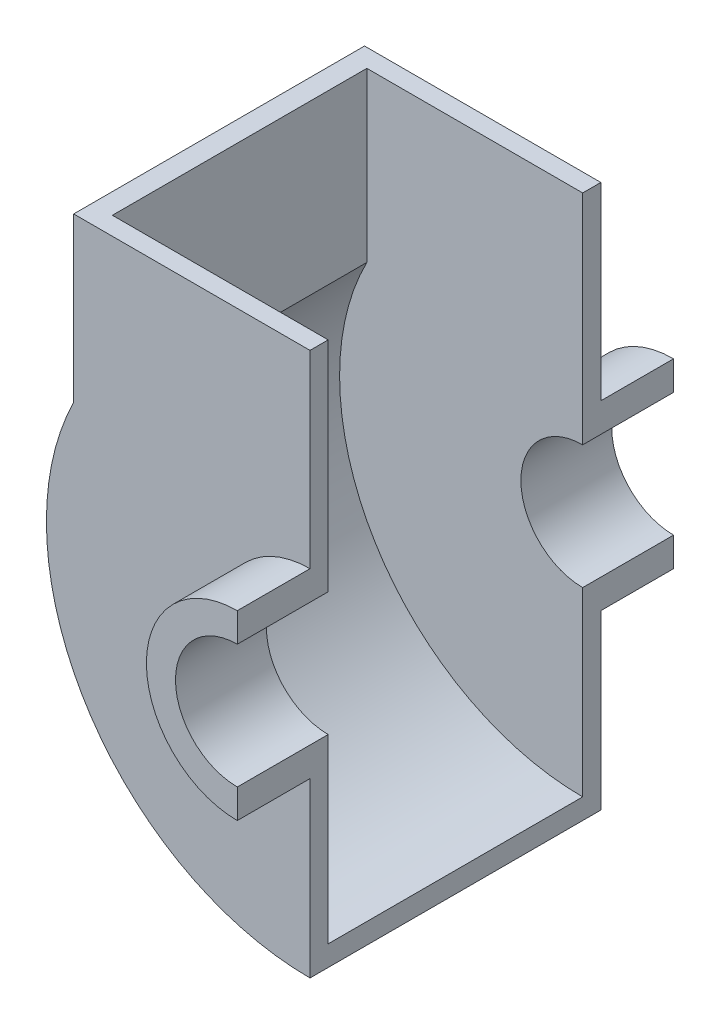
ISO-10303-21;
HEADER;
FILE_DESCRIPTION(('STEP AP214'),'2;1');
FILE_NAME('part.step','',(''),(''),'','','');
FILE_SCHEMA(('AUTOMOTIVE_DESIGN { 1 0 10303 214 1 1 1 1 }'));
ENDSEC;
DATA;
#1=APPLICATION_CONTEXT('core data for automotive mechanical design processes');
#2=APPLICATION_PROTOCOL_DEFINITION('international standard','automotive_design',2000,#1);
#3=PRODUCT_CONTEXT('',#1,'mechanical');
#4=PRODUCT('Part','Part','',(#3));
#5=PRODUCT_RELATED_PRODUCT_CATEGORY('part','',(#4));
#6=PRODUCT_DEFINITION_FORMATION('','',#4);
#7=PRODUCT_DEFINITION_CONTEXT('part definition',#1,'design');
#8=PRODUCT_DEFINITION('design','',#6,#7);
#9=PRODUCT_DEFINITION_SHAPE('','',#8);
#10=(LENGTH_UNIT() NAMED_UNIT(*) SI_UNIT(.MILLI.,.METRE.));
#11=(NAMED_UNIT(*) PLANE_ANGLE_UNIT() SI_UNIT($,.RADIAN.));
#12=(NAMED_UNIT(*) SI_UNIT($,.STERADIAN.) SOLID_ANGLE_UNIT());
#13=UNCERTAINTY_MEASURE_WITH_UNIT(LENGTH_MEASURE(1.E-05),#10,'distance_accuracy_value','');
#14=(GEOMETRIC_REPRESENTATION_CONTEXT(3) GLOBAL_UNCERTAINTY_ASSIGNED_CONTEXT((#13)) GLOBAL_UNIT_ASSIGNED_CONTEXT((#10,
#11,#12)) REPRESENTATION_CONTEXT('',''));
#15=CARTESIAN_POINT('',(0.,0.,0.));
#16=DIRECTION('',(0.,0.,1.));
#17=DIRECTION('',(1.,0.,0.));
#18=AXIS2_PLACEMENT_3D('',#15,#16,#17);
#19=CARTESIAN_POINT('',(0.,0.,-5.));
#20=DIRECTION('',(0.,0.,1.));
#21=DIRECTION('',(1.,0.,0.));
#22=AXIS2_PLACEMENT_3D('',#19,#20,#21);
#23=PLANE('',#22);
#24=CARTESIAN_POINT('',(0.,0.,-5.));
#25=DIRECTION('',(0.,0.,1.));
#26=DIRECTION('',(1.,0.,0.));
#27=AXIS2_PLACEMENT_3D('',#24,#25,#26);
#28=CIRCLE('',#27,66.86);
#29=CARTESIAN_POINT('',(-59.36,30.7676778454273,-5.));
#30=VERTEX_POINT('',#29);
#31=CARTESIAN_POINT('',(0.,-66.86,-5.));
#32=VERTEX_POINT('',#31);
#33=EDGE_CURVE('E204',#30,#32,#28,.T.);
#34=ORIENTED_EDGE('',*,*,#33,.F.);
#35=DIRECTION('',(0.,-1.,0.));
#36=VECTOR('',#35,1.);
#37=CARTESIAN_POINT('',(-59.36,77.,-5.));
#38=LINE('',#37,#36);
#39=CARTESIAN_POINT('',(-59.36,77.,-5.));
#40=VERTEX_POINT('',#39);
#41=EDGE_CURVE('E56',#40,#30,#38,.T.);
#42=ORIENTED_EDGE('',*,*,#41,.F.);
#43=DIRECTION('',(-1.,0.,0.));
#44=VECTOR('',#43,1.);
#45=CARTESIAN_POINT('',(0.,77.,-5.));
#46=LINE('',#45,#44);
#47=CARTESIAN_POINT('',(0.,77.,-5.));
#48=VERTEX_POINT('',#47);
#49=EDGE_CURVE('E211',#48,#40,#46,.T.);
#50=ORIENTED_EDGE('',*,*,#49,.F.);
#51=DIRECTION('',(0.,1.,0.));
#52=VECTOR('',#51,1.);
#53=CARTESIAN_POINT('',(0.,25.,-5.));
#54=LINE('',#53,#52);
#55=CARTESIAN_POINT('',(0.,17.,-5.));
#56=VERTEX_POINT('',#55);
#57=EDGE_CURVE('E254',#56,#48,#54,.T.);
#58=ORIENTED_EDGE('',*,*,#57,.F.);
#59=CARTESIAN_POINT('',(0.,0.,-5.));
#60=DIRECTION('',(0.,0.,-1.));
#61=DIRECTION('',(1.,0.,0.));
#62=AXIS2_PLACEMENT_3D('',#59,#60,#61);
#63=CIRCLE('',#62,17.);
#64=CARTESIAN_POINT('',(0.,-17.,-5.));
#65=VERTEX_POINT('',#64);
#66=EDGE_CURVE('E251',#65,#56,#63,.T.);
#67=ORIENTED_EDGE('',*,*,#66,.F.);
#68=DIRECTION('',(0.,1.,0.));
#69=VECTOR('',#68,1.);
#70=CARTESIAN_POINT('',(0.,-17.,-5.));
#71=LINE('',#70,#69);
#72=EDGE_CURVE('E62',#32,#65,#71,.T.);
#73=ORIENTED_EDGE('',*,*,#72,.F.);
#74=EDGE_LOOP('',(#34,#42,#50,#58,#67,#73));
#75=FACE_BOUND('',#74,.T.);
#76=ADVANCED_FACE('F39',(#75),#23,.F.);
#77=CARTESIAN_POINT('',(0.,0.,-5.));
#78=DIRECTION('',(0.,0.,1.));
#79=DIRECTION('',(1.,0.,0.));
#80=AXIS2_PLACEMENT_3D('',#77,#78,#79);
#81=CYLINDRICAL_SURFACE('',#80,25.);
#82=CARTESIAN_POINT('',(0.,0.,0.));
#83=DIRECTION('',(0.,0.,-1.));
#84=DIRECTION('',(1.,0.,0.));
#85=AXIS2_PLACEMENT_3D('',#82,#83,#84);
#86=CIRCLE('',#85,25.);
#87=CARTESIAN_POINT('',(0.,-25.,0.));
#88=VERTEX_POINT('',#87);
#89=CARTESIAN_POINT('',(0.,25.,0.));
#90=VERTEX_POINT('',#89);
#91=EDGE_CURVE('E210',#88,#90,#86,.T.);
#92=ORIENTED_EDGE('',*,*,#91,.F.);
#93=DIRECTION('',(0.,0.,1.));
#94=VECTOR('',#93,1.);
#95=CARTESIAN_POINT('',(0.,-25.,-5.));
#96=LINE('',#95,#94);
#97=CARTESIAN_POINT('',(0.,-25.,20.));
#98=VERTEX_POINT('',#97);
#99=EDGE_CURVE('E43',#88,#98,#96,.T.);
#100=ORIENTED_EDGE('',*,*,#99,.T.);
#101=CARTESIAN_POINT('',(0.,0.,20.));
#102=DIRECTION('',(0.,0.,1.));
#103=DIRECTION('',(1.,0.,0.));
#104=AXIS2_PLACEMENT_3D('',#101,#102,#103);
#105=CIRCLE('',#104,25.);
#106=CARTESIAN_POINT('',(0.,25.,20.));
#107=VERTEX_POINT('',#106);
#108=EDGE_CURVE('E233',#107,#98,#105,.T.);
#109=ORIENTED_EDGE('',*,*,#108,.F.);
#110=DIRECTION('',(0.,0.,1.));
#111=VECTOR('',#110,1.);
#112=CARTESIAN_POINT('',(0.,25.,-5.));
#113=LINE('',#112,#111);
#114=EDGE_CURVE('E11',#90,#107,#113,.T.);
#115=ORIENTED_EDGE('',*,*,#114,.F.);
#116=EDGE_LOOP('',(#92,#100,#109,#115));
#117=FACE_BOUND('',#116,.T.);
#118=ADVANCED_FACE('F41',(#117),#81,.T.);
#119=CARTESIAN_POINT('',(0.,25.,-5.));
#120=DIRECTION('',(1.,0.,0.));
#121=DIRECTION('',(0.,1.,0.));
#122=AXIS2_PLACEMENT_3D('',#119,#120,#121);
#123=PLANE('',#122);
#124=ORIENTED_EDGE('',*,*,#57,.T.);
#125=DIRECTION('',(0.,0.,1.));
#126=VECTOR('',#125,1.);
#127=CARTESIAN_POINT('',(0.,77.,-5.));
#128=LINE('',#127,#126);
#129=CARTESIAN_POINT('',(0.,77.,0.));
#130=VERTEX_POINT('',#129);
#131=EDGE_CURVE('E213',#48,#130,#128,.T.);
#132=ORIENTED_EDGE('',*,*,#131,.T.);
#133=DIRECTION('',(0.,1.,0.));
#134=VECTOR('',#133,1.);
#135=CARTESIAN_POINT('',(0.,25.,0.));
#136=LINE('',#135,#134);
#137=EDGE_CURVE('E217',#90,#130,#136,.T.);
#138=ORIENTED_EDGE('',*,*,#137,.F.);
#139=ORIENTED_EDGE('',*,*,#114,.T.);
#140=DIRECTION('',(0.,1.,0.));
#141=VECTOR('',#140,1.);
#142=CARTESIAN_POINT('',(0.,25.,20.));
#143=LINE('',#142,#141);
#144=CARTESIAN_POINT('',(0.,17.,20.));
#145=VERTEX_POINT('',#144);
#146=EDGE_CURVE('E247',#145,#107,#143,.T.);
#147=ORIENTED_EDGE('',*,*,#146,.F.);
#148=DIRECTION('',(0.,0.,1.));
#149=VECTOR('',#148,1.);
#150=CARTESIAN_POINT('',(0.,17.,-5.));
#151=LINE('',#150,#149);
#152=EDGE_CURVE('E48',#56,#145,#151,.T.);
#153=ORIENTED_EDGE('',*,*,#152,.F.);
#154=EDGE_LOOP('',(#124,#132,#138,#139,#147,#153));
#155=FACE_BOUND('',#154,.T.);
#156=ADVANCED_FACE('F270',(#155),#123,.T.);
#157=CARTESIAN_POINT('',(0.,0.,-5.));
#158=DIRECTION('',(0.,0.,1.));
#159=DIRECTION('',(1.,0.,0.));
#160=AXIS2_PLACEMENT_3D('',#157,#158,#159);
#161=CYLINDRICAL_SURFACE('',#160,17.);
#162=ORIENTED_EDGE('',*,*,#152,.T.);
#163=CARTESIAN_POINT('',(0.,0.,20.));
#164=DIRECTION('',(0.,0.,-1.));
#165=DIRECTION('',(1.,0.,0.));
#166=AXIS2_PLACEMENT_3D('',#163,#164,#165);
#167=CIRCLE('',#166,17.);
#168=CARTESIAN_POINT('',(0.,-17.,20.));
#169=VERTEX_POINT('',#168);
#170=EDGE_CURVE('E244',#169,#145,#167,.T.);
#171=ORIENTED_EDGE('',*,*,#170,.F.);
#172=DIRECTION('',(0.,0.,1.));
#173=VECTOR('',#172,1.);
#174=CARTESIAN_POINT('',(0.,-17.,-5.));
#175=LINE('',#174,#173);
#176=EDGE_CURVE('E256',#65,#169,#175,.T.);
#177=ORIENTED_EDGE('',*,*,#176,.F.);
#178=ORIENTED_EDGE('',*,*,#66,.T.);
#179=EDGE_LOOP('',(#162,#171,#177,#178));
#180=FACE_BOUND('',#179,.T.);
#181=ADVANCED_FACE('F324',(#180),#161,.F.);
#182=CARTESIAN_POINT('',(0.,-17.,-5.));
#183=DIRECTION('',(1.,0.,0.));
#184=DIRECTION('',(0.,1.,0.));
#185=AXIS2_PLACEMENT_3D('',#182,#183,#184);
#186=PLANE('',#185);
#187=ORIENTED_EDGE('',*,*,#176,.T.);
#188=DIRECTION('',(0.,1.,0.));
#189=VECTOR('',#188,1.);
#190=CARTESIAN_POINT('',(0.,-17.,20.));
#191=LINE('',#190,#189);
#192=EDGE_CURVE('E241',#98,#169,#191,.T.);
#193=ORIENTED_EDGE('',*,*,#192,.F.);
#194=ORIENTED_EDGE('',*,*,#99,.F.);
#195=DIRECTION('',(0.,1.,0.));
#196=VECTOR('',#195,1.);
#197=CARTESIAN_POINT('',(0.,-25.,0.));
#198=LINE('',#197,#196);
#199=CARTESIAN_POINT('',(0.,-72.5,0.));
#200=VERTEX_POINT('',#199);
#201=EDGE_CURVE('E214',#200,#88,#198,.T.);
#202=ORIENTED_EDGE('',*,*,#201,.F.);
#203=DIRECTION('',(0.,0.,1.));
#204=VECTOR('',#203,1.);
#205=CARTESIAN_POINT('',(0.,-72.5,-5.));
#206=LINE('',#205,#204);
#207=CARTESIAN_POINT('',(0.,-72.5,-80.));
#208=VERTEX_POINT('',#207);
#209=EDGE_CURVE('E231',#208,#200,#206,.T.);
#210=ORIENTED_EDGE('',*,*,#209,.F.);
#211=DIRECTION('',(0.,1.,0.));
#212=VECTOR('',#211,1.);
#213=CARTESIAN_POINT('',(0.,-25.,-80.));
#214=LINE('',#213,#212);
#215=CARTESIAN_POINT('',(0.,-25.,-80.));
#216=VERTEX_POINT('',#215);
#217=EDGE_CURVE('E166',#208,#216,#214,.T.);
#218=ORIENTED_EDGE('',*,*,#217,.T.);
#219=DIRECTION('',(0.,0.,-1.));
#220=VECTOR('',#219,1.);
#221=CARTESIAN_POINT('',(0.,-25.,-75.));
#222=LINE('',#221,#220);
#223=CARTESIAN_POINT('',(0.,-25.,-100.));
#224=VERTEX_POINT('',#223);
#225=EDGE_CURVE('E181',#216,#224,#222,.T.);
#226=ORIENTED_EDGE('',*,*,#225,.T.);
#227=DIRECTION('',(0.,1.,0.));
#228=VECTOR('',#227,1.);
#229=CARTESIAN_POINT('',(0.,-17.,-100.));
#230=LINE('',#229,#228);
#231=CARTESIAN_POINT('',(0.,-17.,-100.));
#232=VERTEX_POINT('',#231);
#233=EDGE_CURVE('E297',#224,#232,#230,.T.);
#234=ORIENTED_EDGE('',*,*,#233,.T.);
#235=DIRECTION('',(0.,0.,-1.));
#236=VECTOR('',#235,1.);
#237=CARTESIAN_POINT('',(0.,-17.,-75.));
#238=LINE('',#237,#236);
#239=CARTESIAN_POINT('',(0.,-17.,-75.));
#240=VERTEX_POINT('',#239);
#241=EDGE_CURVE('E184',#240,#232,#238,.T.);
#242=ORIENTED_EDGE('',*,*,#241,.F.);
#243=DIRECTION('',(0.,1.,0.));
#244=VECTOR('',#243,1.);
#245=CARTESIAN_POINT('',(0.,-17.,-75.));
#246=LINE('',#245,#244);
#247=CARTESIAN_POINT('',(0.,-66.86,-75.));
#248=VERTEX_POINT('',#247);
#249=EDGE_CURVE('E186',#248,#240,#246,.T.);
#250=ORIENTED_EDGE('',*,*,#249,.F.);
#251=DIRECTION('',(0.,0.,-1.));
#252=VECTOR('',#251,1.);
#253=CARTESIAN_POINT('',(0.,-66.86,20.002));
#254=LINE('',#253,#252);
#255=EDGE_CURVE('E202',#32,#248,#254,.T.);
#256=ORIENTED_EDGE('',*,*,#255,.F.);
#257=ORIENTED_EDGE('',*,*,#72,.T.);
#258=EDGE_LOOP('',(#187,#193,#194,#202,#210,#218,#226,#234,#242,#250,#256,#257));
#259=FACE_BOUND('',#258,.T.);
#260=ADVANCED_FACE('F264',(#259),#186,.T.);
#261=CARTESIAN_POINT('',(0.,0.,20.));
#262=DIRECTION('',(0.,0.,1.));
#263=DIRECTION('',(1.,0.,0.));
#264=AXIS2_PLACEMENT_3D('',#261,#262,#263);
#265=PLANE('',#264);
#266=ORIENTED_EDGE('',*,*,#108,.T.);
#267=ORIENTED_EDGE('',*,*,#192,.T.);
#268=ORIENTED_EDGE('',*,*,#170,.T.);
#269=ORIENTED_EDGE('',*,*,#146,.T.);
#270=EDGE_LOOP('',(#266,#267,#268,#269));
#271=FACE_BOUND('',#270,.T.);
#272=ADVANCED_FACE('F267',(#271),#265,.T.);
#273=CARTESIAN_POINT('',(0.,0.,-5.));
#274=DIRECTION('',(0.,0.,1.));
#275=DIRECTION('',(1.,0.,0.));
#276=AXIS2_PLACEMENT_3D('',#273,#274,#275);
#277=CYLINDRICAL_SURFACE('',#276,72.5);
#278=CARTESIAN_POINT('',(0.,0.,0.));
#279=DIRECTION('',(0.,0.,1.));
#280=DIRECTION('',(1.,0.,0.));
#281=AXIS2_PLACEMENT_3D('',#278,#279,#280);
#282=CIRCLE('',#281,72.5);
#283=CARTESIAN_POINT('',(-65.,32.1130814466628,0.));
#284=VERTEX_POINT('',#283);
#285=EDGE_CURVE('E226',#284,#200,#282,.T.);
#286=ORIENTED_EDGE('',*,*,#285,.F.);
#287=DIRECTION('',(0.,0.,1.));
#288=VECTOR('',#287,1.);
#289=CARTESIAN_POINT('',(-65.,32.1130814466628,-5.));
#290=LINE('',#289,#288);
#291=CARTESIAN_POINT('',(-65.,32.1130814466628,-80.));
#292=VERTEX_POINT('',#291);
#293=EDGE_CURVE('E234',#292,#284,#290,.T.);
#294=ORIENTED_EDGE('',*,*,#293,.F.);
#295=CARTESIAN_POINT('',(0.,0.,-80.));
#296=DIRECTION('',(0.,0.,1.));
#297=DIRECTION('',(1.,0.,0.));
#298=AXIS2_PLACEMENT_3D('',#295,#296,#297);
#299=CIRCLE('',#298,72.5);
#300=EDGE_CURVE('E281',#292,#208,#299,.T.);
#301=ORIENTED_EDGE('',*,*,#300,.T.);
#302=ORIENTED_EDGE('',*,*,#209,.T.);
#303=EDGE_LOOP('',(#286,#294,#301,#302));
#304=FACE_BOUND('',#303,.T.);
#305=ADVANCED_FACE('F282',(#304),#277,.T.);
#306=CARTESIAN_POINT('',(-65.,77.,-5.));
#307=DIRECTION('',(-1.,0.,0.));
#308=DIRECTION('',(0.,-1.,0.));
#309=AXIS2_PLACEMENT_3D('',#306,#307,#308);
#310=PLANE('',#309);
#311=DIRECTION('',(0.,-1.,0.));
#312=VECTOR('',#311,1.);
#313=CARTESIAN_POINT('',(-65.,77.,0.));
#314=LINE('',#313,#312);
#315=CARTESIAN_POINT('',(-65.,77.,0.));
#316=VERTEX_POINT('',#315);
#317=EDGE_CURVE('E223',#316,#284,#314,.T.);
#318=ORIENTED_EDGE('',*,*,#317,.F.);
#319=DIRECTION('',(0.,0.,1.));
#320=VECTOR('',#319,1.);
#321=CARTESIAN_POINT('',(-65.,77.,-5.));
#322=LINE('',#321,#320);
#323=CARTESIAN_POINT('',(-65.,77.,-80.));
#324=VERTEX_POINT('',#323);
#325=EDGE_CURVE('E236',#324,#316,#322,.T.);
#326=ORIENTED_EDGE('',*,*,#325,.F.);
#327=DIRECTION('',(0.,-1.,0.));
#328=VECTOR('',#327,1.);
#329=CARTESIAN_POINT('',(-65.,77.,-80.));
#330=LINE('',#329,#328);
#331=EDGE_CURVE('E286',#324,#292,#330,.T.);
#332=ORIENTED_EDGE('',*,*,#331,.T.);
#333=ORIENTED_EDGE('',*,*,#293,.T.);
#334=EDGE_LOOP('',(#318,#326,#332,#333));
#335=FACE_BOUND('',#334,.T.);
#336=ADVANCED_FACE('F321',(#335),#310,.T.);
#337=CARTESIAN_POINT('',(0.,77.,-5.));
#338=DIRECTION('',(0.,1.,0.));
#339=DIRECTION('',(-1.,0.,0.));
#340=AXIS2_PLACEMENT_3D('',#337,#338,#339);
#341=PLANE('',#340);
#342=DIRECTION('',(-1.,0.,0.));
#343=VECTOR('',#342,1.);
#344=CARTESIAN_POINT('',(0.,77.,0.));
#345=LINE('',#344,#343);
#346=EDGE_CURVE('E220',#130,#316,#345,.T.);
#347=ORIENTED_EDGE('',*,*,#346,.F.);
#348=ORIENTED_EDGE('',*,*,#131,.F.);
#349=ORIENTED_EDGE('',*,*,#49,.T.);
#350=DIRECTION('',(0.,0.,-1.));
#351=VECTOR('',#350,1.);
#352=CARTESIAN_POINT('',(-59.36,77.,20.002));
#353=LINE('',#352,#351);
#354=CARTESIAN_POINT('',(-59.36,77.,-75.));
#355=VERTEX_POINT('',#354);
#356=EDGE_CURVE('E161',#40,#355,#353,.T.);
#357=ORIENTED_EDGE('',*,*,#356,.T.);
#358=DIRECTION('',(-1.,0.,0.));
#359=VECTOR('',#358,1.);
#360=CARTESIAN_POINT('',(0.,77.,-75.));
#361=LINE('',#360,#359);
#362=CARTESIAN_POINT('',(0.,77.,-75.));
#363=VERTEX_POINT('',#362);
#364=EDGE_CURVE('E153',#363,#355,#361,.T.);
#365=ORIENTED_EDGE('',*,*,#364,.F.);
#366=DIRECTION('',(0.,0.,-1.));
#367=VECTOR('',#366,1.);
#368=CARTESIAN_POINT('',(0.,77.,-75.));
#369=LINE('',#368,#367);
#370=CARTESIAN_POINT('',(0.,77.,-80.));
#371=VERTEX_POINT('',#370);
#372=EDGE_CURVE('E158',#363,#371,#369,.T.);
#373=ORIENTED_EDGE('',*,*,#372,.T.);
#374=DIRECTION('',(-1.,0.,0.));
#375=VECTOR('',#374,1.);
#376=CARTESIAN_POINT('',(0.,77.,-80.));
#377=LINE('',#376,#375);
#378=EDGE_CURVE('E316',#371,#324,#377,.T.);
#379=ORIENTED_EDGE('',*,*,#378,.T.);
#380=ORIENTED_EDGE('',*,*,#325,.T.);
#381=EDGE_LOOP('',(#347,#348,#349,#357,#365,#373,#379,#380));
#382=FACE_BOUND('',#381,.T.);
#383=ADVANCED_FACE('F156',(#382),#341,.T.);
#384=CARTESIAN_POINT('',(0.,0.,0.));
#385=DIRECTION('',(0.,0.,1.));
#386=DIRECTION('',(1.,0.,0.));
#387=AXIS2_PLACEMENT_3D('',#384,#385,#386);
#388=PLANE('',#387);
#389=ORIENTED_EDGE('',*,*,#91,.T.);
#390=ORIENTED_EDGE('',*,*,#137,.T.);
#391=ORIENTED_EDGE('',*,*,#346,.T.);
#392=ORIENTED_EDGE('',*,*,#317,.T.);
#393=ORIENTED_EDGE('',*,*,#285,.T.);
#394=ORIENTED_EDGE('',*,*,#201,.T.);
#395=EDGE_LOOP('',(#389,#390,#391,#392,#393,#394));
#396=FACE_BOUND('',#395,.T.);
#397=ADVANCED_FACE('F274',(#396),#388,.T.);
#398=CARTESIAN_POINT('',(-59.36,77.,20.002));
#399=DIRECTION('',(1.,0.,0.));
#400=DIRECTION('',(0.,0.,-1.));
#401=AXIS2_PLACEMENT_3D('',#398,#399,#400);
#402=PLANE('',#401);
#403=ORIENTED_EDGE('',*,*,#356,.F.);
#404=ORIENTED_EDGE('',*,*,#41,.T.);
#405=DIRECTION('',(0.,0.,-1.));
#406=VECTOR('',#405,1.);
#407=CARTESIAN_POINT('',(-59.36,30.7676778454273,20.002));
#408=LINE('',#407,#406);
#409=CARTESIAN_POINT('',(-59.36,30.7676778454273,-75.));
#410=VERTEX_POINT('',#409);
#411=EDGE_CURVE('E205',#30,#410,#408,.T.);
#412=ORIENTED_EDGE('',*,*,#411,.T.);
#413=DIRECTION('',(0.,-1.,0.));
#414=VECTOR('',#413,1.);
#415=CARTESIAN_POINT('',(-59.36,77.,-75.));
#416=LINE('',#415,#414);
#417=EDGE_CURVE('E193',#355,#410,#416,.T.);
#418=ORIENTED_EDGE('',*,*,#417,.F.);
#419=EDGE_LOOP('',(#403,#404,#412,#418));
#420=FACE_BOUND('',#419,.T.);
#421=ADVANCED_FACE('F348',(#420),#402,.T.);
#422=CARTESIAN_POINT('',(0.,0.,20.002));
#423=DIRECTION('',(0.,0.,-1.));
#424=DIRECTION('',(-1.,0.,0.));
#425=AXIS2_PLACEMENT_3D('',#422,#423,#424);
#426=CYLINDRICAL_SURFACE('',#425,66.86);
#427=ORIENTED_EDGE('',*,*,#411,.F.);
#428=ORIENTED_EDGE('',*,*,#33,.T.);
#429=ORIENTED_EDGE('',*,*,#255,.T.);
#430=CARTESIAN_POINT('',(0.,0.,-75.));
#431=DIRECTION('',(0.,0.,1.));
#432=DIRECTION('',(-1.,0.,0.));
#433=AXIS2_PLACEMENT_3D('',#430,#431,#432);
#434=CIRCLE('',#433,66.86);
#435=EDGE_CURVE('E199',#410,#248,#434,.T.);
#436=ORIENTED_EDGE('',*,*,#435,.F.);
#437=EDGE_LOOP('',(#427,#428,#429,#436));
#438=FACE_BOUND('',#437,.T.);
#439=ADVANCED_FACE('F349',(#438),#426,.F.);
#440=CARTESIAN_POINT('',(0.,0.,-75.));
#441=DIRECTION('',(0.,0.,-1.));
#442=DIRECTION('',(1.,0.,0.));
#443=AXIS2_PLACEMENT_3D('',#440,#441,#442);
#444=PLANE('',#443);
#445=ORIENTED_EDGE('',*,*,#364,.T.);
#446=ORIENTED_EDGE('',*,*,#417,.T.);
#447=ORIENTED_EDGE('',*,*,#435,.T.);
#448=ORIENTED_EDGE('',*,*,#249,.T.);
#449=CARTESIAN_POINT('',(0.,0.,-75.));
#450=DIRECTION('',(0.,0.,-1.));
#451=DIRECTION('',(1.,0.,0.));
#452=AXIS2_PLACEMENT_3D('',#449,#450,#451);
#453=CIRCLE('',#452,17.);
#454=CARTESIAN_POINT('',(0.,17.,-75.));
#455=VERTEX_POINT('',#454);
#456=EDGE_CURVE('E179',#240,#455,#453,.T.);
#457=ORIENTED_EDGE('',*,*,#456,.T.);
#458=DIRECTION('',(0.,1.,0.));
#459=VECTOR('',#458,1.);
#460=CARTESIAN_POINT('',(0.,25.,-75.));
#461=LINE('',#460,#459);
#462=EDGE_CURVE('E172',#455,#363,#461,.T.);
#463=ORIENTED_EDGE('',*,*,#462,.T.);
#464=EDGE_LOOP('',(#445,#446,#447,#448,#457,#463));
#465=FACE_BOUND('',#464,.T.);
#466=ADVANCED_FACE('F177',(#465),#444,.F.);
#467=CARTESIAN_POINT('',(0.,0.,-75.));
#468=DIRECTION('',(0.,0.,-1.));
#469=DIRECTION('',(1.,0.,0.));
#470=AXIS2_PLACEMENT_3D('',#467,#468,#469);
#471=CYLINDRICAL_SURFACE('',#470,25.);
#472=CARTESIAN_POINT('',(0.,0.,-80.));
#473=DIRECTION('',(0.,0.,-1.));
#474=DIRECTION('',(1.,0.,0.));
#475=AXIS2_PLACEMENT_3D('',#472,#473,#474);
#476=CIRCLE('',#475,25.);
#477=CARTESIAN_POINT('',(0.,25.,-80.));
#478=VERTEX_POINT('',#477);
#479=EDGE_CURVE('E291',#216,#478,#476,.T.);
#480=ORIENTED_EDGE('',*,*,#479,.T.);
#481=DIRECTION('',(0.,0.,-1.));
#482=VECTOR('',#481,1.);
#483=CARTESIAN_POINT('',(0.,25.,-75.));
#484=LINE('',#483,#482);
#485=CARTESIAN_POINT('',(0.,25.,-100.));
#486=VERTEX_POINT('',#485);
#487=EDGE_CURVE('E190',#478,#486,#484,.T.);
#488=ORIENTED_EDGE('',*,*,#487,.T.);
#489=CARTESIAN_POINT('',(0.,0.,-100.));
#490=DIRECTION('',(0.,0.,1.));
#491=DIRECTION('',(1.,0.,0.));
#492=AXIS2_PLACEMENT_3D('',#489,#490,#491);
#493=CIRCLE('',#492,25.);
#494=EDGE_CURVE('E175',#486,#224,#493,.T.);
#495=ORIENTED_EDGE('',*,*,#494,.T.);
#496=ORIENTED_EDGE('',*,*,#225,.F.);
#497=EDGE_LOOP('',(#480,#488,#495,#496));
#498=FACE_BOUND('',#497,.T.);
#499=ADVANCED_FACE('F314',(#498),#471,.T.);
#500=CARTESIAN_POINT('',(0.,25.,-75.));
#501=DIRECTION('',(1.,0.,0.));
#502=DIRECTION('',(0.,1.,0.));
#503=AXIS2_PLACEMENT_3D('',#500,#501,#502);
#504=PLANE('',#503);
#505=ORIENTED_EDGE('',*,*,#462,.F.);
#506=DIRECTION('',(0.,0.,-1.));
#507=VECTOR('',#506,1.);
#508=CARTESIAN_POINT('',(0.,17.,-75.));
#509=LINE('',#508,#507);
#510=CARTESIAN_POINT('',(0.,17.,-100.));
#511=VERTEX_POINT('',#510);
#512=EDGE_CURVE('E194',#455,#511,#509,.T.);
#513=ORIENTED_EDGE('',*,*,#512,.T.);
#514=DIRECTION('',(0.,1.,0.));
#515=VECTOR('',#514,1.);
#516=CARTESIAN_POINT('',(0.,25.,-100.));
#517=LINE('',#516,#515);
#518=EDGE_CURVE('E301',#511,#486,#517,.T.);
#519=ORIENTED_EDGE('',*,*,#518,.T.);
#520=ORIENTED_EDGE('',*,*,#487,.F.);
#521=DIRECTION('',(0.,1.,0.));
#522=VECTOR('',#521,1.);
#523=CARTESIAN_POINT('',(0.,25.,-80.));
#524=LINE('',#523,#522);
#525=EDGE_CURVE('E174',#478,#371,#524,.T.);
#526=ORIENTED_EDGE('',*,*,#525,.T.);
#527=ORIENTED_EDGE('',*,*,#372,.F.);
#528=EDGE_LOOP('',(#505,#513,#519,#520,#526,#527));
#529=FACE_BOUND('',#528,.T.);
#530=ADVANCED_FACE('F170',(#529),#504,.T.);
#531=CARTESIAN_POINT('',(0.,0.,-75.));
#532=DIRECTION('',(0.,0.,-1.));
#533=DIRECTION('',(1.,0.,0.));
#534=AXIS2_PLACEMENT_3D('',#531,#532,#533);
#535=CYLINDRICAL_SURFACE('',#534,17.);
#536=ORIENTED_EDGE('',*,*,#512,.F.);
#537=ORIENTED_EDGE('',*,*,#456,.F.);
#538=ORIENTED_EDGE('',*,*,#241,.T.);
#539=CARTESIAN_POINT('',(0.,0.,-100.));
#540=DIRECTION('',(0.,0.,-1.));
#541=DIRECTION('',(1.,0.,0.));
#542=AXIS2_PLACEMENT_3D('',#539,#540,#541);
#543=CIRCLE('',#542,17.);
#544=EDGE_CURVE('E299',#232,#511,#543,.T.);
#545=ORIENTED_EDGE('',*,*,#544,.T.);
#546=EDGE_LOOP('',(#536,#537,#538,#545));
#547=FACE_BOUND('',#546,.T.);
#548=ADVANCED_FACE('F308',(#547),#535,.F.);
#549=CARTESIAN_POINT('',(0.,0.,-100.));
#550=DIRECTION('',(0.,0.,-1.));
#551=DIRECTION('',(1.,0.,0.));
#552=AXIS2_PLACEMENT_3D('',#549,#550,#551);
#553=PLANE('',#552);
#554=ORIENTED_EDGE('',*,*,#494,.F.);
#555=ORIENTED_EDGE('',*,*,#518,.F.);
#556=ORIENTED_EDGE('',*,*,#544,.F.);
#557=ORIENTED_EDGE('',*,*,#233,.F.);
#558=EDGE_LOOP('',(#554,#555,#556,#557));
#559=FACE_BOUND('',#558,.T.);
#560=ADVANCED_FACE('F312',(#559),#553,.T.);
#561=CARTESIAN_POINT('',(0.,0.,-80.));
#562=DIRECTION('',(0.,0.,-1.));
#563=DIRECTION('',(1.,0.,0.));
#564=AXIS2_PLACEMENT_3D('',#561,#562,#563);
#565=PLANE('',#564);
#566=ORIENTED_EDGE('',*,*,#479,.F.);
#567=ORIENTED_EDGE('',*,*,#217,.F.);
#568=ORIENTED_EDGE('',*,*,#300,.F.);
#569=ORIENTED_EDGE('',*,*,#331,.F.);
#570=ORIENTED_EDGE('',*,*,#378,.F.);
#571=ORIENTED_EDGE('',*,*,#525,.F.);
#572=EDGE_LOOP('',(#566,#567,#568,#569,#570,#571));
#573=FACE_BOUND('',#572,.T.);
#574=ADVANCED_FACE('F289',(#573),#565,.T.);
#575=CLOSED_SHELL('',(#76,#118,#156,#181,#260,#272,#305,#336,#383,#397,#421,#439,#466,#499,#530,
#548,#560,#574));
#576=MANIFOLD_SOLID_BREP('B2',#575);
#577=ADVANCED_BREP_SHAPE_REPRESENTATION('',(#18,#576),#14);
#578=SHAPE_DEFINITION_REPRESENTATION(#9,#577);
ENDSEC;
END-ISO-10303-21;
